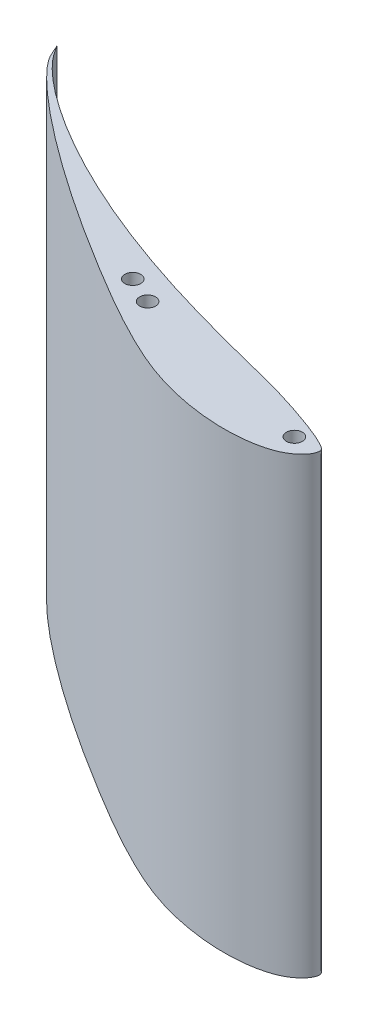
ISO-10303-21;
HEADER;
FILE_DESCRIPTION(('STEP AP214'),'2;1');
FILE_NAME('part.step','',(''),(''),'','','');
FILE_SCHEMA(('AUTOMOTIVE_DESIGN { 1 0 10303 214 1 1 1 1 }'));
ENDSEC;
DATA;
#1=APPLICATION_CONTEXT('core data for automotive mechanical design processes');
#2=APPLICATION_PROTOCOL_DEFINITION('international standard','automotive_design',2000,#1);
#3=PRODUCT_CONTEXT('',#1,'mechanical');
#4=PRODUCT('Part','Part','',(#3));
#5=PRODUCT_RELATED_PRODUCT_CATEGORY('part','',(#4));
#6=PRODUCT_DEFINITION_FORMATION('','',#4);
#7=PRODUCT_DEFINITION_CONTEXT('part definition',#1,'design');
#8=PRODUCT_DEFINITION('design','',#6,#7);
#9=PRODUCT_DEFINITION_SHAPE('','',#8);
#10=(LENGTH_UNIT() NAMED_UNIT(*) SI_UNIT(.MILLI.,.METRE.));
#11=(NAMED_UNIT(*) PLANE_ANGLE_UNIT() SI_UNIT($,.RADIAN.));
#12=(NAMED_UNIT(*) SI_UNIT($,.STERADIAN.) SOLID_ANGLE_UNIT());
#13=UNCERTAINTY_MEASURE_WITH_UNIT(LENGTH_MEASURE(1.E-05),#10,'distance_accuracy_value','');
#14=(GEOMETRIC_REPRESENTATION_CONTEXT(3) GLOBAL_UNCERTAINTY_ASSIGNED_CONTEXT((#13)) GLOBAL_UNIT_ASSIGNED_CONTEXT((#10,
#11,#12)) REPRESENTATION_CONTEXT('',''));
#15=CARTESIAN_POINT('',(0.,0.,0.));
#16=DIRECTION('',(0.,0.,1.));
#17=DIRECTION('',(1.,0.,0.));
#18=AXIS2_PLACEMENT_3D('',#15,#16,#17);
#19=CARTESIAN_POINT('',(0.,456.35,0.));
#20=DIRECTION('',(0.,1.,0.));
#21=DIRECTION('',(0.,0.,-1.));
#22=AXIS2_PLACEMENT_3D('',#19,#20,#21);
#23=PLANE('',#22);
#24=CARTESIAN_POINT('',(1427.35277447502,456.35,-85.9922861997096));
#25=DIRECTION('',(0.,-1.,0.));
#26=DIRECTION('',(0.,0.,-1.));
#27=AXIS2_PLACEMENT_3D('',#24,#25,#26);
#28=CIRCLE('',#27,4.82599999999999);
#29=CARTESIAN_POINT('',(1427.35277447502,456.35,-90.8182861997096));
#30=VERTEX_POINT('',#29);
#31=EDGE_CURVE('E47',#30,#30,#28,.F.);
#32=ORIENTED_EDGE('',*,*,#31,.T.);
#33=EDGE_LOOP('',(#32));
#34=FACE_BOUND('',#33,.T.);
#35=CARTESIAN_POINT('',(1497.20277447502,456.35,-65.5788539001513));
#36=DIRECTION('',(0.,-1.,0.));
#37=DIRECTION('',(0.,0.,-1.));
#38=AXIS2_PLACEMENT_3D('',#35,#36,#37);
#39=CIRCLE('',#38,4.82599999999999);
#40=CARTESIAN_POINT('',(1497.20277447502,456.35,-70.4048539001513));
#41=VERTEX_POINT('',#40);
#42=EDGE_CURVE('E63',#41,#41,#39,.F.);
#43=ORIENTED_EDGE('',*,*,#42,.T.);
#44=EDGE_LOOP('',(#43));
#45=FACE_BOUND('',#44,.T.);
#46=CARTESIAN_POINT('',(1301.76817920433,456.35,-168.821946374357));
#47=CARTESIAN_POINT('',(1301.77230928268,456.35,-168.827184756951));
#48=CARTESIAN_POINT('',(1302.37026553102,456.35,-167.824503164993));
#49=CARTESIAN_POINT('',(1303.0670145412,456.35,-166.784416006747));
#50=CARTESIAN_POINT('',(1304.88593269216,456.35,-164.088123642936));
#51=CARTESIAN_POINT('',(1307.5476034657,456.35,-160.847919070288));
#52=CARTESIAN_POINT('',(1311.5146644538,456.35,-156.813159100025));
#53=CARTESIAN_POINT('',(1316.60043625192,456.35,-152.39390670423));
#54=CARTESIAN_POINT('',(1322.7344873275,456.35,-147.619297173726));
#55=CARTESIAN_POINT('',(1329.82666913246,456.35,-142.626387743659));
#56=CARTESIAN_POINT('',(1337.80786676856,456.35,-137.503795170644));
#57=CARTESIAN_POINT('',(1346.58273540001,456.35,-132.336571176161));
#58=CARTESIAN_POINT('',(1356.05768116616,456.35,-127.209537801169));
#59=CARTESIAN_POINT('',(1366.11900630482,456.35,-122.184854942838));
#60=CARTESIAN_POINT('',(1376.65300968089,456.35,-117.323287061737));
#61=CARTESIAN_POINT('',(1387.54097239609,456.35,-112.676510908259));
#62=CARTESIAN_POINT('',(1398.65746945663,456.35,-108.279274217042));
#63=CARTESIAN_POINT('',(1409.87753457672,456.35,-104.158603348825));
#64=CARTESIAN_POINT('',(1421.081728217,456.35,-100.341187670002));
#65=CARTESIAN_POINT('',(1432.14503205613,456.35,-96.8219925056807));
#66=CARTESIAN_POINT('',(1442.95527451464,456.35,-93.6054919568445));
#67=CARTESIAN_POINT('',(1453.39962149735,456.35,-90.6772569919237));
#68=CARTESIAN_POINT('',(1463.37792285089,456.35,-88.0190342392536));
#69=CARTESIAN_POINT('',(1472.79377383569,456.35,-85.6008013084872));
#70=CARTESIAN_POINT('',(1481.56135155584,456.35,-83.3805800883322));
#71=CARTESIAN_POINT('',(1489.62316119267,456.35,-81.3378562841343));
#72=CARTESIAN_POINT('',(1496.94092070038,456.35,-79.294041517136));
#73=CARTESIAN_POINT('',(1503.53165280073,456.35,-77.1993180118677));
#74=CARTESIAN_POINT('',(1509.45905739774,456.35,-75.1980924242951));
#75=CARTESIAN_POINT('',(1514.70195423595,456.35,-73.3166711072991));
#76=CARTESIAN_POINT('',(1519.20400185839,456.35,-71.5685381877784));
#77=CARTESIAN_POINT('',(1522.93635228667,456.35,-70.018689353663));
#78=CARTESIAN_POINT('',(1525.79794543055,456.35,-68.5584918961369));
#79=CARTESIAN_POINT('',(1527.87539444029,456.35,-67.460315988068));
#80=CARTESIAN_POINT('',(1529.10595246632,456.35,-65.96953453019));
#81=CARTESIAN_POINT('',(1528.82395868676,456.35,-64.2549893999787));
#82=CARTESIAN_POINT('',(1528.12474102668,456.35,-62.5684270164491));
#83=CARTESIAN_POINT('',(1526.83850565479,456.35,-60.7887592431716));
#84=CARTESIAN_POINT('',(1525.06515596246,456.35,-59.0378927261086));
#85=CARTESIAN_POINT('',(1522.79926459791,456.35,-57.3796313800017));
#86=CARTESIAN_POINT('',(1520.070943671,456.35,-55.8614545176717));
#87=CARTESIAN_POINT('',(1516.84595878187,456.35,-54.5854561925764));
#88=CARTESIAN_POINT('',(1513.1438132248,456.35,-53.5666188188184));
#89=CARTESIAN_POINT('',(1508.99143847943,456.35,-52.7623901485262));
#90=CARTESIAN_POINT('',(1504.41239036176,456.35,-52.2199014322748));
#91=CARTESIAN_POINT('',(1499.44286057953,456.35,-51.9585726569494));
#92=CARTESIAN_POINT('',(1494.11575167384,456.35,-51.9923953428432));
#93=CARTESIAN_POINT('',(1488.4642158499,456.35,-52.3556889089875));
#94=CARTESIAN_POINT('',(1482.52262584961,456.35,-53.044596233826));
#95=CARTESIAN_POINT('',(1476.33153255328,456.35,-54.0889300463021));
#96=CARTESIAN_POINT('',(1469.9266641389,456.35,-55.5046966428795));
#97=CARTESIAN_POINT('',(1463.34742206955,456.35,-57.3607640172919));
#98=CARTESIAN_POINT('',(1456.59107517091,456.35,-59.6551305880773));
#99=CARTESIAN_POINT('',(1449.66191577131,456.35,-62.4652615009422));
#100=CARTESIAN_POINT('',(1442.5442456471,456.35,-65.7643616569194));
#101=CARTESIAN_POINT('',(1435.18890768738,456.35,-69.4125063905048));
#102=CARTESIAN_POINT('',(1427.65125866868,456.35,-73.4288799442274));
#103=CARTESIAN_POINT('',(1419.95244751865,456.35,-77.7466033557538));
#104=CARTESIAN_POINT('',(1412.12319940181,456.35,-82.3126159995078));
#105=CARTESIAN_POINT('',(1404.20136632811,456.35,-87.0579250557882));
#106=CARTESIAN_POINT('',(1396.24724131293,456.35,-91.9347760795541));
#107=CARTESIAN_POINT('',(1388.31910662654,456.35,-96.8865851607311));
#108=CARTESIAN_POINT('',(1380.48757220338,456.35,-101.889258295426));
#109=CARTESIAN_POINT('',(1372.81144977995,456.35,-106.911034585631));
#110=CARTESIAN_POINT('',(1365.33909817995,456.35,-111.917939331574));
#111=CARTESIAN_POINT('',(1358.12374396176,456.35,-116.888097110586));
#112=CARTESIAN_POINT('',(1351.20260067889,456.35,-121.783503341325));
#113=CARTESIAN_POINT('',(1344.62235887579,456.35,-126.579987308515));
#114=CARTESIAN_POINT('',(1338.4172049877,456.35,-131.240362347408));
#115=CARTESIAN_POINT('',(1332.62568351272,456.35,-135.737569045043));
#116=CARTESIAN_POINT('',(1327.28211686832,456.35,-140.044381970496));
#117=CARTESIAN_POINT('',(1322.41609503182,456.35,-144.133867720064));
#118=CARTESIAN_POINT('',(1318.05193524216,456.35,-147.977980559625));
#119=CARTESIAN_POINT('',(1314.21470322521,456.35,-151.556539314559));
#120=CARTESIAN_POINT('',(1310.92192770647,456.35,-154.845842060006));
#121=CARTESIAN_POINT('',(1308.1873592663,456.35,-157.827091089311));
#122=CARTESIAN_POINT('',(1306.0070640266,456.35,-160.478382565387));
#123=CARTESIAN_POINT('',(1304.39628079841,456.35,-162.91593537051));
#124=CARTESIAN_POINT('',(1303.38729858081,456.35,-165.059047867722));
#125=CARTESIAN_POINT('',(1302.59127015099,456.35,-167.002468542047));
#126=CARTESIAN_POINT('',(1302.24987201621,456.35,-167.914379262662));
#127=CARTESIAN_POINT('',(1301.76413141712,456.35,-168.816812365694));
#128=CARTESIAN_POINT('',(1301.76817920433,456.35,-168.821946374357));
#129=B_SPLINE_CURVE_WITH_KNOTS('',3,(#46,#47,#48,#49,#50,#51,#52,#53,#54,#55,#56,#57,#58,#59,
#60,#61,#62,#63,#64,#65,#66,#67,#68,#69,#70,#71,#72,#73,#74,#75,#76,#77,#78,#79,#80,#81,#82,#83,
#84,#85,#86,#87,#88,#89,#90,#91,#92,#93,#94,#95,#96,#97,#98,#99,#100,#101,#102,#103,#104,#105,
#106,#107,#108,#109,#110,#111,#112,#113,#114,#115,#116,#117,#118,#119,#120,#121,#122,#123,#124,
#125,#126,#127,#128),.UNSPECIFIED.,.T.,.F.,(4,1,1,1,1,1,1,1,1,1,1,1,1,1,1,1,1,1,1,1,1,1,1,1,1,1,
1,1,1,1,1,1,1,1,1,1,1,1,1,1,1,1,1,1,1,1,1,1,1,1,1,1,1,1,1,1,1,1,1,1,1,1,1,1,1,1,1,1,1,1,1,1,1,1,
1,1,1,1,1,1,4),(0.,0.000999594313299212,0.00414743475003776,0.00974820897402395,
0.0180443769200241,0.0288641783652488,0.0418307896412056,0.0567138069576779,0.0733412324180671,
0.0915079886594422,0.111021837040934,0.131661709492213,0.153207715119588,0.175433402170293,
0.198110317315045,0.221011446315139,0.243905882495844,0.266573311035611,0.288810349135398,
0.310405035997316,0.331177743204304,0.350943876391454,0.369556399670184,0.386864963345299,
0.402753039208367,0.417195875784384,0.430379518903367,0.442362633174289,0.453032155511853,
0.462284345612072,0.470026206002306,0.476176644820514,0.480649947409099,0.483553073373249,
0.486420689318958,0.489953231463337,0.494096926743959,0.498850588304447,0.504196750280792,
0.510125492183598,0.516691031253851,0.524011699263473,0.532092122465354,0.540897920896839,
0.550403413935838,0.56058104089174,0.571396483088815,0.582828080950064,0.594829641292505,
0.607347037120814,0.620384325080165,0.633968936607918,0.648199967415963,0.663193936825189,
0.678898580785939,0.695226562400326,0.712113220733955,0.729459406270428,0.747143116877991,
0.765009771536014,0.782904928287736,0.800688045055655,0.818242104849469,0.835449083117584,
0.852211620697039,0.868429578359411,0.884009362888173,0.898854951230209,0.912881826809319,
0.926010749515415,0.938166770937821,0.949289699209522,0.959322171916738,0.968216949447241,
0.975948220006129,0.982474409223121,0.987904722814407,0.992516501480522,0.996351137832237,
0.999020322442866,1.),.UNSPECIFIED.);
#130=CARTESIAN_POINT('',(1301.76817920433,456.35,-168.821946374357));
#131=VERTEX_POINT('',#130);
#132=EDGE_CURVE('E11',#131,#131,#129,.T.);
#133=ORIENTED_EDGE('',*,*,#132,.T.);
#134=EDGE_LOOP('',(#133));
#135=FACE_BOUND('',#134,.T.);
#136=ADVANCED_FACE('F45',(#34,#45,#135),#23,.F.);
#137=CARTESIAN_POINT('',(0.,670.,0.));
#138=DIRECTION('',(0.,1.,0.));
#139=DIRECTION('',(0.,0.,-1.));
#140=AXIS2_PLACEMENT_3D('',#137,#138,#139);
#141=PLANE('',#140);
#142=CARTESIAN_POINT('',(1517.12542242341,670.,-65.3696695748364));
#143=DIRECTION('',(0.,-1.,0.));
#144=DIRECTION('',(0.,0.,-1.));
#145=AXIS2_PLACEMENT_3D('',#142,#143,#144);
#146=CIRCLE('',#145,3.77189999999996);
#147=CARTESIAN_POINT('',(1517.12542242341,670.,-69.1415695748364));
#148=VERTEX_POINT('',#147);
#149=EDGE_CURVE('E78',#148,#148,#146,.T.);
#150=ORIENTED_EDGE('',*,*,#149,.T.);
#151=EDGE_LOOP('',(#150));
#152=FACE_BOUND('',#151,.T.);
#153=CARTESIAN_POINT('',(1427.35277447502,670.,-85.9922861997074));
#154=DIRECTION('',(0.,-1.,0.));
#155=DIRECTION('',(0.,0.,-1.));
#156=AXIS2_PLACEMENT_3D('',#153,#154,#155);
#157=CIRCLE('',#156,3.77189999999996);
#158=CARTESIAN_POINT('',(1427.35277447502,670.,-89.7641861997073));
#159=VERTEX_POINT('',#158);
#160=EDGE_CURVE('E95',#159,#159,#157,.T.);
#161=ORIENTED_EDGE('',*,*,#160,.T.);
#162=EDGE_LOOP('',(#161));
#163=FACE_BOUND('',#162,.T.);
#164=CARTESIAN_POINT('',(1414.65277447502,670.,-91.6945912254613));
#165=DIRECTION('',(0.,-1.,0.));
#166=DIRECTION('',(0.,0.,-1.));
#167=AXIS2_PLACEMENT_3D('',#164,#165,#166);
#168=CIRCLE('',#167,3.77189999999996);
#169=CARTESIAN_POINT('',(1414.65277447502,670.,-95.4664912254613));
#170=VERTEX_POINT('',#169);
#171=EDGE_CURVE('E89',#170,#170,#168,.T.);
#172=ORIENTED_EDGE('',*,*,#171,.T.);
#173=EDGE_LOOP('',(#172));
#174=FACE_BOUND('',#173,.T.);
#175=CARTESIAN_POINT('',(1301.76817920433,670.,-168.821946374357));
#176=CARTESIAN_POINT('',(1301.77230928268,670.,-168.827184756951));
#177=CARTESIAN_POINT('',(1302.37026553102,670.,-167.824503164993));
#178=CARTESIAN_POINT('',(1303.0670145412,670.,-166.784416006747));
#179=CARTESIAN_POINT('',(1304.88593269216,670.,-164.088123642936));
#180=CARTESIAN_POINT('',(1307.5476034657,670.,-160.847919070288));
#181=CARTESIAN_POINT('',(1311.5146644538,670.,-156.813159100025));
#182=CARTESIAN_POINT('',(1316.60043625192,670.,-152.39390670423));
#183=CARTESIAN_POINT('',(1322.7344873275,670.,-147.619297173726));
#184=CARTESIAN_POINT('',(1329.82666913246,670.,-142.626387743659));
#185=CARTESIAN_POINT('',(1337.80786676856,670.,-137.503795170644));
#186=CARTESIAN_POINT('',(1346.58273540001,670.,-132.336571176161));
#187=CARTESIAN_POINT('',(1356.05768116616,670.,-127.209537801169));
#188=CARTESIAN_POINT('',(1366.11900630482,670.,-122.184854942838));
#189=CARTESIAN_POINT('',(1376.65300968089,670.,-117.323287061737));
#190=CARTESIAN_POINT('',(1387.54097239609,670.,-112.676510908259));
#191=CARTESIAN_POINT('',(1398.65746945663,670.,-108.279274217042));
#192=CARTESIAN_POINT('',(1409.87753457672,670.,-104.158603348825));
#193=CARTESIAN_POINT('',(1421.081728217,670.,-100.341187670002));
#194=CARTESIAN_POINT('',(1432.14503205613,670.,-96.8219925056807));
#195=CARTESIAN_POINT('',(1442.95527451464,670.,-93.6054919568445));
#196=CARTESIAN_POINT('',(1453.39962149735,670.,-90.6772569919237));
#197=CARTESIAN_POINT('',(1463.37792285089,670.,-88.0190342392536));
#198=CARTESIAN_POINT('',(1472.79377383569,670.,-85.6008013084872));
#199=CARTESIAN_POINT('',(1481.56135155584,670.,-83.3805800883322));
#200=CARTESIAN_POINT('',(1489.62316119267,670.,-81.3378562841343));
#201=CARTESIAN_POINT('',(1496.94092070038,670.,-79.294041517136));
#202=CARTESIAN_POINT('',(1503.53165280073,670.,-77.1993180118677));
#203=CARTESIAN_POINT('',(1509.45905739774,670.,-75.1980924242951));
#204=CARTESIAN_POINT('',(1514.70195423595,670.,-73.3166711072991));
#205=CARTESIAN_POINT('',(1519.20400185839,670.,-71.5685381877784));
#206=CARTESIAN_POINT('',(1522.93635228667,670.,-70.018689353663));
#207=CARTESIAN_POINT('',(1525.79794543055,670.,-68.5584918961369));
#208=CARTESIAN_POINT('',(1527.87539444029,670.,-67.460315988068));
#209=CARTESIAN_POINT('',(1529.10595246632,670.,-65.96953453019));
#210=CARTESIAN_POINT('',(1528.82395868676,670.,-64.2549893999787));
#211=CARTESIAN_POINT('',(1528.12474102668,670.,-62.5684270164491));
#212=CARTESIAN_POINT('',(1526.83850565479,670.,-60.7887592431716));
#213=CARTESIAN_POINT('',(1525.06515596246,670.,-59.0378927261086));
#214=CARTESIAN_POINT('',(1522.79926459791,670.,-57.3796313800017));
#215=CARTESIAN_POINT('',(1520.070943671,670.,-55.8614545176717));
#216=CARTESIAN_POINT('',(1516.84595878187,670.,-54.5854561925764));
#217=CARTESIAN_POINT('',(1513.1438132248,670.,-53.5666188188184));
#218=CARTESIAN_POINT('',(1508.99143847943,670.,-52.7623901485262));
#219=CARTESIAN_POINT('',(1504.41239036176,670.,-52.2199014322748));
#220=CARTESIAN_POINT('',(1499.44286057953,670.,-51.9585726569494));
#221=CARTESIAN_POINT('',(1494.11575167384,670.,-51.9923953428432));
#222=CARTESIAN_POINT('',(1488.4642158499,670.,-52.3556889089875));
#223=CARTESIAN_POINT('',(1482.52262584961,670.,-53.044596233826));
#224=CARTESIAN_POINT('',(1476.33153255328,670.,-54.0889300463021));
#225=CARTESIAN_POINT('',(1469.9266641389,670.,-55.5046966428795));
#226=CARTESIAN_POINT('',(1463.34742206955,670.,-57.3607640172919));
#227=CARTESIAN_POINT('',(1456.59107517091,670.,-59.6551305880773));
#228=CARTESIAN_POINT('',(1449.66191577131,670.,-62.4652615009422));
#229=CARTESIAN_POINT('',(1442.5442456471,670.,-65.7643616569194));
#230=CARTESIAN_POINT('',(1435.18890768738,670.,-69.4125063905048));
#231=CARTESIAN_POINT('',(1427.65125866868,670.,-73.4288799442274));
#232=CARTESIAN_POINT('',(1419.95244751865,670.,-77.7466033557538));
#233=CARTESIAN_POINT('',(1412.12319940181,670.,-82.3126159995078));
#234=CARTESIAN_POINT('',(1404.20136632811,670.,-87.0579250557882));
#235=CARTESIAN_POINT('',(1396.24724131293,670.,-91.9347760795541));
#236=CARTESIAN_POINT('',(1388.31910662654,670.,-96.8865851607311));
#237=CARTESIAN_POINT('',(1380.48757220338,670.,-101.889258295426));
#238=CARTESIAN_POINT('',(1372.81144977995,670.,-106.911034585631));
#239=CARTESIAN_POINT('',(1365.33909817995,670.,-111.917939331574));
#240=CARTESIAN_POINT('',(1358.12374396176,670.,-116.888097110586));
#241=CARTESIAN_POINT('',(1351.20260067889,670.,-121.783503341325));
#242=CARTESIAN_POINT('',(1344.62235887579,670.,-126.579987308515));
#243=CARTESIAN_POINT('',(1338.4172049877,670.,-131.240362347408));
#244=CARTESIAN_POINT('',(1332.62568351272,670.,-135.737569045043));
#245=CARTESIAN_POINT('',(1327.28211686832,670.,-140.044381970496));
#246=CARTESIAN_POINT('',(1322.41609503182,670.,-144.133867720064));
#247=CARTESIAN_POINT('',(1318.05193524216,670.,-147.977980559625));
#248=CARTESIAN_POINT('',(1314.21470322521,670.,-151.556539314559));
#249=CARTESIAN_POINT('',(1310.92192770647,670.,-154.845842060006));
#250=CARTESIAN_POINT('',(1308.1873592663,670.,-157.827091089311));
#251=CARTESIAN_POINT('',(1306.0070640266,670.,-160.478382565387));
#252=CARTESIAN_POINT('',(1304.39628079841,670.,-162.91593537051));
#253=CARTESIAN_POINT('',(1303.38729858081,670.,-165.059047867722));
#254=CARTESIAN_POINT('',(1302.59127015099,670.,-167.002468542047));
#255=CARTESIAN_POINT('',(1302.24987201621,670.,-167.914379262662));
#256=CARTESIAN_POINT('',(1301.76413141712,670.,-168.816812365694));
#257=CARTESIAN_POINT('',(1301.76817920433,670.,-168.821946374357));
#258=B_SPLINE_CURVE_WITH_KNOTS('',3,(#175,#176,#177,#178,#179,#180,#181,#182,#183,#184,#185,
#186,#187,#188,#189,#190,#191,#192,#193,#194,#195,#196,#197,#198,#199,#200,#201,#202,#203,#204,
#205,#206,#207,#208,#209,#210,#211,#212,#213,#214,#215,#216,#217,#218,#219,#220,#221,#222,#223,
#224,#225,#226,#227,#228,#229,#230,#231,#232,#233,#234,#235,#236,#237,#238,#239,#240,#241,#242,
#243,#244,#245,#246,#247,#248,#249,#250,#251,#252,#253,#254,#255,#256,#257),.UNSPECIFIED.,.T.,
.F.,(4,1,1,1,1,1,1,1,1,1,1,1,1,1,1,1,1,1,1,1,1,1,1,1,1,1,1,1,1,1,1,1,1,1,1,1,1,1,1,1,1,1,1,1,1,
1,1,1,1,1,1,1,1,1,1,1,1,1,1,1,1,1,1,1,1,1,1,1,1,1,1,1,1,1,1,1,1,1,1,1,4),(0.,
0.000999594313299212,0.00414743475003776,0.00974820897402395,0.0180443769200241,
0.0288641783652488,0.0418307896412056,0.0567138069576779,0.0733412324180671,0.0915079886594422,
0.111021837040934,0.131661709492213,0.153207715119588,0.175433402170293,0.198110317315045,
0.221011446315139,0.243905882495844,0.266573311035611,0.288810349135398,0.310405035997316,
0.331177743204304,0.350943876391454,0.369556399670184,0.386864963345299,0.402753039208367,
0.417195875784384,0.430379518903367,0.442362633174289,0.453032155511853,0.462284345612072,
0.470026206002306,0.476176644820514,0.480649947409099,0.483553073373249,0.486420689318958,
0.489953231463337,0.494096926743959,0.498850588304447,0.504196750280792,0.510125492183598,
0.516691031253851,0.524011699263473,0.532092122465354,0.540897920896839,0.550403413935838,
0.56058104089174,0.571396483088815,0.582828080950064,0.594829641292505,0.607347037120814,
0.620384325080165,0.633968936607918,0.648199967415963,0.663193936825189,0.678898580785939,
0.695226562400326,0.712113220733955,0.729459406270428,0.747143116877991,0.765009771536014,
0.782904928287736,0.800688045055655,0.818242104849469,0.835449083117584,0.852211620697039,
0.868429578359411,0.884009362888173,0.898854951230209,0.912881826809319,0.926010749515415,
0.938166770937821,0.949289699209522,0.959322171916738,0.968216949447241,0.975948220006129,
0.982474409223121,0.987904722814407,0.992516501480522,0.996351137832237,0.999020322442866,1.),.UNSPECIFIED.);
#259=CARTESIAN_POINT('',(1301.76817920433,670.,-168.821946374357));
#260=VERTEX_POINT('',#259);
#261=EDGE_CURVE('E51',#260,#260,#258,.T.);
#262=ORIENTED_EDGE('',*,*,#261,.F.);
#263=EDGE_LOOP('',(#262));
#264=FACE_BOUND('',#263,.T.);
#265=ADVANCED_FACE('F104',(#152,#163,#174,#264),#141,.T.);
#266=CARTESIAN_POINT('',(1301.76817920433,450.,-168.821946374357));
#267=CARTESIAN_POINT('',(1301.77230928268,450.,-168.827184756951));
#268=CARTESIAN_POINT('',(1302.37026553102,450.,-167.824503164993));
#269=CARTESIAN_POINT('',(1303.0670145412,450.,-166.784416006747));
#270=CARTESIAN_POINT('',(1304.88593269216,450.,-164.088123642936));
#271=CARTESIAN_POINT('',(1307.5476034657,450.,-160.847919070288));
#272=CARTESIAN_POINT('',(1311.5146644538,450.,-156.813159100025));
#273=CARTESIAN_POINT('',(1316.60043625192,450.,-152.39390670423));
#274=CARTESIAN_POINT('',(1322.7344873275,450.,-147.619297173726));
#275=CARTESIAN_POINT('',(1329.82666913246,450.,-142.626387743659));
#276=CARTESIAN_POINT('',(1337.80786676856,450.,-137.503795170644));
#277=CARTESIAN_POINT('',(1346.58273540001,450.,-132.336571176161));
#278=CARTESIAN_POINT('',(1356.05768116616,450.,-127.209537801169));
#279=CARTESIAN_POINT('',(1366.11900630482,450.,-122.184854942838));
#280=CARTESIAN_POINT('',(1376.65300968089,450.,-117.323287061737));
#281=CARTESIAN_POINT('',(1387.54097239609,450.,-112.676510908259));
#282=CARTESIAN_POINT('',(1398.65746945663,450.,-108.279274217042));
#283=CARTESIAN_POINT('',(1409.87753457672,450.,-104.158603348825));
#284=CARTESIAN_POINT('',(1421.081728217,450.,-100.341187670002));
#285=CARTESIAN_POINT('',(1432.14503205613,450.,-96.8219925056807));
#286=CARTESIAN_POINT('',(1442.95527451464,450.,-93.6054919568445));
#287=CARTESIAN_POINT('',(1453.39962149735,450.,-90.6772569919237));
#288=CARTESIAN_POINT('',(1463.37792285089,450.,-88.0190342392536));
#289=CARTESIAN_POINT('',(1472.79377383569,450.,-85.6008013084872));
#290=CARTESIAN_POINT('',(1481.56135155584,450.,-83.3805800883322));
#291=CARTESIAN_POINT('',(1489.62316119267,450.,-81.3378562841343));
#292=CARTESIAN_POINT('',(1496.94092070038,450.,-79.294041517136));
#293=CARTESIAN_POINT('',(1503.53165280073,450.,-77.1993180118677));
#294=CARTESIAN_POINT('',(1509.45905739774,450.,-75.1980924242951));
#295=CARTESIAN_POINT('',(1514.70195423595,450.,-73.3166711072991));
#296=CARTESIAN_POINT('',(1519.20400185839,450.,-71.5685381877784));
#297=CARTESIAN_POINT('',(1522.93635228667,450.,-70.018689353663));
#298=CARTESIAN_POINT('',(1525.79794543055,450.,-68.5584918961369));
#299=CARTESIAN_POINT('',(1527.87539444029,450.,-67.460315988068));
#300=CARTESIAN_POINT('',(1529.10595246632,450.,-65.96953453019));
#301=CARTESIAN_POINT('',(1528.82395868676,450.,-64.2549893999787));
#302=CARTESIAN_POINT('',(1528.12474102668,450.,-62.5684270164491));
#303=CARTESIAN_POINT('',(1526.83850565479,450.,-60.7887592431716));
#304=CARTESIAN_POINT('',(1525.06515596246,450.,-59.0378927261086));
#305=CARTESIAN_POINT('',(1522.79926459791,450.,-57.3796313800017));
#306=CARTESIAN_POINT('',(1520.070943671,450.,-55.8614545176717));
#307=CARTESIAN_POINT('',(1516.84595878187,450.,-54.5854561925764));
#308=CARTESIAN_POINT('',(1513.1438132248,450.,-53.5666188188184));
#309=CARTESIAN_POINT('',(1508.99143847943,450.,-52.7623901485262));
#310=CARTESIAN_POINT('',(1504.41239036176,450.,-52.2199014322748));
#311=CARTESIAN_POINT('',(1499.44286057953,450.,-51.9585726569494));
#312=CARTESIAN_POINT('',(1494.11575167384,450.,-51.9923953428432));
#313=CARTESIAN_POINT('',(1488.4642158499,450.,-52.3556889089875));
#314=CARTESIAN_POINT('',(1482.52262584961,450.,-53.044596233826));
#315=CARTESIAN_POINT('',(1476.33153255328,450.,-54.0889300463021));
#316=CARTESIAN_POINT('',(1469.9266641389,450.,-55.5046966428795));
#317=CARTESIAN_POINT('',(1463.34742206955,450.,-57.3607640172919));
#318=CARTESIAN_POINT('',(1456.59107517091,450.,-59.6551305880773));
#319=CARTESIAN_POINT('',(1449.66191577131,450.,-62.4652615009422));
#320=CARTESIAN_POINT('',(1442.5442456471,450.,-65.7643616569194));
#321=CARTESIAN_POINT('',(1435.18890768738,450.,-69.4125063905048));
#322=CARTESIAN_POINT('',(1427.65125866868,450.,-73.4288799442274));
#323=CARTESIAN_POINT('',(1419.95244751865,450.,-77.7466033557538));
#324=CARTESIAN_POINT('',(1412.12319940181,450.,-82.3126159995078));
#325=CARTESIAN_POINT('',(1404.20136632811,450.,-87.0579250557882));
#326=CARTESIAN_POINT('',(1396.24724131293,450.,-91.9347760795541));
#327=CARTESIAN_POINT('',(1388.31910662654,450.,-96.8865851607311));
#328=CARTESIAN_POINT('',(1380.48757220338,450.,-101.889258295426));
#329=CARTESIAN_POINT('',(1372.81144977995,450.,-106.911034585631));
#330=CARTESIAN_POINT('',(1365.33909817995,450.,-111.917939331574));
#331=CARTESIAN_POINT('',(1358.12374396176,450.,-116.888097110586));
#332=CARTESIAN_POINT('',(1351.20260067889,450.,-121.783503341325));
#333=CARTESIAN_POINT('',(1344.62235887579,450.,-126.579987308515));
#334=CARTESIAN_POINT('',(1338.4172049877,450.,-131.240362347408));
#335=CARTESIAN_POINT('',(1332.62568351272,450.,-135.737569045043));
#336=CARTESIAN_POINT('',(1327.28211686832,450.,-140.044381970496));
#337=CARTESIAN_POINT('',(1322.41609503182,450.,-144.133867720064));
#338=CARTESIAN_POINT('',(1318.05193524216,450.,-147.977980559625));
#339=CARTESIAN_POINT('',(1314.21470322521,450.,-151.556539314559));
#340=CARTESIAN_POINT('',(1310.92192770647,450.,-154.845842060006));
#341=CARTESIAN_POINT('',(1308.1873592663,450.,-157.827091089311));
#342=CARTESIAN_POINT('',(1306.0070640266,450.,-160.478382565387));
#343=CARTESIAN_POINT('',(1304.39628079841,450.,-162.91593537051));
#344=CARTESIAN_POINT('',(1303.38729858081,450.,-165.059047867722));
#345=CARTESIAN_POINT('',(1302.59127015099,450.,-167.002468542047));
#346=CARTESIAN_POINT('',(1302.24987201621,450.,-167.914379262662));
#347=CARTESIAN_POINT('',(1301.76413141712,450.,-168.816812365694));
#348=CARTESIAN_POINT('',(1301.76817920433,450.,-168.821946374357));
#349=B_SPLINE_CURVE_WITH_KNOTS('',3,(#266,#267,#268,#269,#270,#271,#272,#273,#274,#275,#276,
#277,#278,#279,#280,#281,#282,#283,#284,#285,#286,#287,#288,#289,#290,#291,#292,#293,#294,#295,
#296,#297,#298,#299,#300,#301,#302,#303,#304,#305,#306,#307,#308,#309,#310,#311,#312,#313,#314,
#315,#316,#317,#318,#319,#320,#321,#322,#323,#324,#325,#326,#327,#328,#329,#330,#331,#332,#333,
#334,#335,#336,#337,#338,#339,#340,#341,#342,#343,#344,#345,#346,#347,#348),.UNSPECIFIED.,.T.,
.F.,(4,1,1,1,1,1,1,1,1,1,1,1,1,1,1,1,1,1,1,1,1,1,1,1,1,1,1,1,1,1,1,1,1,1,1,1,1,1,1,1,1,1,1,1,1,
1,1,1,1,1,1,1,1,1,1,1,1,1,1,1,1,1,1,1,1,1,1,1,1,1,1,1,1,1,1,1,1,1,1,1,4),(0.,
0.000999594313299212,0.00414743475003776,0.00974820897402395,0.0180443769200241,
0.0288641783652488,0.0418307896412056,0.0567138069576779,0.0733412324180671,0.0915079886594422,
0.111021837040934,0.131661709492213,0.153207715119588,0.175433402170293,0.198110317315045,
0.221011446315139,0.243905882495844,0.266573311035611,0.288810349135398,0.310405035997316,
0.331177743204304,0.350943876391454,0.369556399670184,0.386864963345299,0.402753039208367,
0.417195875784384,0.430379518903367,0.442362633174289,0.453032155511853,0.462284345612072,
0.470026206002306,0.476176644820514,0.480649947409099,0.483553073373249,0.486420689318958,
0.489953231463337,0.494096926743959,0.498850588304447,0.504196750280792,0.510125492183598,
0.516691031253851,0.524011699263473,0.532092122465354,0.540897920896839,0.550403413935838,
0.56058104089174,0.571396483088815,0.582828080950064,0.594829641292505,0.607347037120814,
0.620384325080165,0.633968936607918,0.648199967415963,0.663193936825189,0.678898580785939,
0.695226562400326,0.712113220733955,0.729459406270428,0.747143116877991,0.765009771536014,
0.782904928287736,0.800688045055655,0.818242104849469,0.835449083117584,0.852211620697039,
0.868429578359411,0.884009362888173,0.898854951230209,0.912881826809319,0.926010749515415,
0.938166770937821,0.949289699209522,0.959322171916738,0.968216949447241,0.975948220006129,
0.982474409223121,0.987904722814407,0.992516501480522,0.996351137832237,0.999020322442866,1.),.UNSPECIFIED.);
#350=DIRECTION('',(0.,-1.,0.));
#351=VECTOR('',#350,1.);
#352=SURFACE_OF_LINEAR_EXTRUSION('',#349,#351);
#353=ORIENTED_EDGE('',*,*,#132,.F.);
#354=EDGE_LOOP('',(#353));
#355=FACE_BOUND('',#354,.T.);
#356=ORIENTED_EDGE('',*,*,#261,.T.);
#357=EDGE_LOOP('',(#356));
#358=FACE_BOUND('',#357,.T.);
#359=ADVANCED_FACE('F127',(#355,#358),#352,.T.);
#360=CARTESIAN_POINT('',(1497.20277447502,481.75,-65.5788539001513));
#361=DIRECTION('',(0.,-1.,0.));
#362=DIRECTION('',(0.,0.,1.));
#363=AXIS2_PLACEMENT_3D('',#360,#361,#362);
#364=CYLINDRICAL_SURFACE('',#363,4.82599999999999);
#365=CARTESIAN_POINT('',(1497.20277447502,481.75,-65.5788539001513));
#366=DIRECTION('',(0.,-1.,0.));
#367=DIRECTION('',(0.,0.,-1.));
#368=AXIS2_PLACEMENT_3D('',#365,#366,#367);
#369=CIRCLE('',#368,4.82599999999999);
#370=CARTESIAN_POINT('',(1497.20277447502,481.75,-70.4048539001513));
#371=VERTEX_POINT('',#370);
#372=EDGE_CURVE('E73',#371,#371,#369,.T.);
#373=ORIENTED_EDGE('',*,*,#372,.F.);
#374=EDGE_LOOP('',(#373));
#375=FACE_BOUND('',#374,.T.);
#376=ORIENTED_EDGE('',*,*,#42,.F.);
#377=EDGE_LOOP('',(#376));
#378=FACE_BOUND('',#377,.T.);
#379=ADVANCED_FACE('F143',(#375,#378),#364,.F.);
#380=CARTESIAN_POINT('',(1497.20277447502,481.75,-65.5788539001513));
#381=DIRECTION('',(0.,1.,0.));
#382=DIRECTION('',(0.,0.,-1.));
#383=AXIS2_PLACEMENT_3D('',#380,#381,#382);
#384=PLANE('',#383);
#385=ORIENTED_EDGE('',*,*,#372,.T.);
#386=EDGE_LOOP('',(#385));
#387=FACE_BOUND('',#386,.T.);
#388=ADVANCED_FACE('F134',(#387),#384,.F.);
#389=CARTESIAN_POINT('',(1427.35277447502,481.75,-85.9922861997096));
#390=DIRECTION('',(0.,-1.,0.));
#391=DIRECTION('',(0.,0.,1.));
#392=AXIS2_PLACEMENT_3D('',#389,#390,#391);
#393=CYLINDRICAL_SURFACE('',#392,4.82599999999999);
#394=CARTESIAN_POINT('',(1427.35277447502,481.75,-85.9922861997096));
#395=DIRECTION('',(0.,-1.,0.));
#396=DIRECTION('',(0.,0.,-1.));
#397=AXIS2_PLACEMENT_3D('',#394,#395,#396);
#398=CIRCLE('',#397,4.82599999999999);
#399=CARTESIAN_POINT('',(1427.35277447502,481.75,-90.8182861997096));
#400=VERTEX_POINT('',#399);
#401=EDGE_CURVE('E68',#400,#400,#398,.T.);
#402=ORIENTED_EDGE('',*,*,#401,.F.);
#403=EDGE_LOOP('',(#402));
#404=FACE_BOUND('',#403,.T.);
#405=ORIENTED_EDGE('',*,*,#31,.F.);
#406=EDGE_LOOP('',(#405));
#407=FACE_BOUND('',#406,.T.);
#408=ADVANCED_FACE('F131',(#404,#407),#393,.F.);
#409=CARTESIAN_POINT('',(1427.35277447502,481.75,-85.9922861997096));
#410=DIRECTION('',(0.,1.,0.));
#411=DIRECTION('',(0.,0.,-1.));
#412=AXIS2_PLACEMENT_3D('',#409,#410,#411);
#413=PLANE('',#412);
#414=ORIENTED_EDGE('',*,*,#401,.T.);
#415=EDGE_LOOP('',(#414));
#416=FACE_BOUND('',#415,.T.);
#417=ADVANCED_FACE('F133',(#416),#413,.F.);
#418=CARTESIAN_POINT('',(1414.65277447502,657.3,-91.6945912254613));
#419=DIRECTION('',(0.,1.,0.));
#420=DIRECTION('',(0.,0.,-1.));
#421=AXIS2_PLACEMENT_3D('',#418,#419,#420);
#422=CYLINDRICAL_SURFACE('',#421,3.77189999999996);
#423=CARTESIAN_POINT('',(1414.65277447502,657.3,-91.6945912254613));
#424=DIRECTION('',(0.,-1.,0.));
#425=DIRECTION('',(0.,0.,-1.));
#426=AXIS2_PLACEMENT_3D('',#423,#424,#425);
#427=CIRCLE('',#426,3.77189999999996);
#428=CARTESIAN_POINT('',(1414.65277447502,657.3,-95.4664912254613));
#429=VERTEX_POINT('',#428);
#430=EDGE_CURVE('E81',#429,#429,#427,.T.);
#431=ORIENTED_EDGE('',*,*,#430,.T.);
#432=EDGE_LOOP('',(#431));
#433=FACE_BOUND('',#432,.T.);
#434=ORIENTED_EDGE('',*,*,#171,.F.);
#435=EDGE_LOOP('',(#434));
#436=FACE_BOUND('',#435,.T.);
#437=ADVANCED_FACE('F141',(#433,#436),#422,.F.);
#438=CARTESIAN_POINT('',(1414.65277447502,657.3,-91.6945912254613));
#439=DIRECTION('',(0.,1.,0.));
#440=DIRECTION('',(0.,0.,-1.));
#441=AXIS2_PLACEMENT_3D('',#438,#439,#440);
#442=PLANE('',#441);
#443=ORIENTED_EDGE('',*,*,#430,.F.);
#444=EDGE_LOOP('',(#443));
#445=FACE_BOUND('',#444,.T.);
#446=ADVANCED_FACE('F199',(#445),#442,.T.);
#447=CARTESIAN_POINT('',(1427.35277447502,657.3,-85.9922861997074));
#448=DIRECTION('',(0.,1.,0.));
#449=DIRECTION('',(0.,0.,-1.));
#450=AXIS2_PLACEMENT_3D('',#447,#448,#449);
#451=CYLINDRICAL_SURFACE('',#450,3.77189999999996);
#452=CARTESIAN_POINT('',(1427.35277447502,657.3,-85.9922861997074));
#453=DIRECTION('',(0.,-1.,0.));
#454=DIRECTION('',(0.,0.,-1.));
#455=AXIS2_PLACEMENT_3D('',#452,#453,#454);
#456=CIRCLE('',#455,3.77189999999996);
#457=CARTESIAN_POINT('',(1427.35277447502,657.3,-89.7641861997073));
#458=VERTEX_POINT('',#457);
#459=EDGE_CURVE('E92',#458,#458,#456,.T.);
#460=ORIENTED_EDGE('',*,*,#459,.T.);
#461=EDGE_LOOP('',(#460));
#462=FACE_BOUND('',#461,.T.);
#463=ORIENTED_EDGE('',*,*,#160,.F.);
#464=EDGE_LOOP('',(#463));
#465=FACE_BOUND('',#464,.T.);
#466=ADVANCED_FACE('F119',(#462,#465),#451,.F.);
#467=CARTESIAN_POINT('',(1427.35277447502,657.3,-85.9922861997074));
#468=DIRECTION('',(0.,1.,0.));
#469=DIRECTION('',(0.,0.,-1.));
#470=AXIS2_PLACEMENT_3D('',#467,#468,#469);
#471=PLANE('',#470);
#472=ORIENTED_EDGE('',*,*,#459,.F.);
#473=EDGE_LOOP('',(#472));
#474=FACE_BOUND('',#473,.T.);
#475=ADVANCED_FACE('F110',(#474),#471,.T.);
#476=CARTESIAN_POINT('',(1517.12542242341,657.3,-65.3696695748364));
#477=DIRECTION('',(0.,1.,0.));
#478=DIRECTION('',(0.,0.,-1.));
#479=AXIS2_PLACEMENT_3D('',#476,#477,#478);
#480=CYLINDRICAL_SURFACE('',#479,3.77189999999996);
#481=CARTESIAN_POINT('',(1517.12542242341,657.3,-65.3696695748364));
#482=DIRECTION('',(0.,-1.,0.));
#483=DIRECTION('',(0.,0.,-1.));
#484=AXIS2_PLACEMENT_3D('',#481,#482,#483);
#485=CIRCLE('',#484,3.77189999999996);
#486=CARTESIAN_POINT('',(1517.12542242341,657.3,-69.1415695748364));
#487=VERTEX_POINT('',#486);
#488=EDGE_CURVE('E98',#487,#487,#485,.T.);
#489=ORIENTED_EDGE('',*,*,#488,.T.);
#490=EDGE_LOOP('',(#489));
#491=FACE_BOUND('',#490,.T.);
#492=ORIENTED_EDGE('',*,*,#149,.F.);
#493=EDGE_LOOP('',(#492));
#494=FACE_BOUND('',#493,.T.);
#495=ADVANCED_FACE('F107',(#491,#494),#480,.F.);
#496=CARTESIAN_POINT('',(1517.12542242341,657.3,-65.3696695748364));
#497=DIRECTION('',(0.,1.,0.));
#498=DIRECTION('',(0.,0.,-1.));
#499=AXIS2_PLACEMENT_3D('',#496,#497,#498);
#500=PLANE('',#499);
#501=ORIENTED_EDGE('',*,*,#488,.F.);
#502=EDGE_LOOP('',(#501));
#503=FACE_BOUND('',#502,.T.);
#504=ADVANCED_FACE('F109',(#503),#500,.T.);
#505=CLOSED_SHELL('',(#136,#265,#359,#379,#388,#408,#417,#437,#446,#466,#475,#495,#504));
#506=MANIFOLD_SOLID_BREP('B2',#505);
#507=ADVANCED_BREP_SHAPE_REPRESENTATION('',(#18,#506),#14);
#508=SHAPE_DEFINITION_REPRESENTATION(#9,#507);
ENDSEC;
END-ISO-10303-21;
